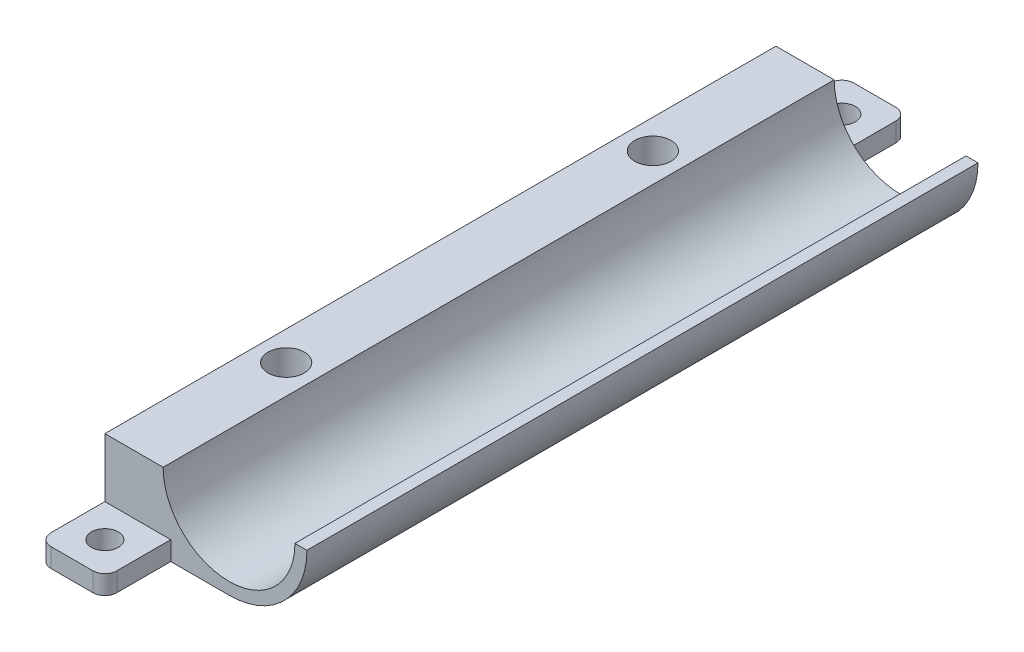
ISO-10303-21;
HEADER;
FILE_DESCRIPTION(('STEP AP214'),'2;1');
FILE_NAME('part.step','',(''),(''),'','','');
FILE_SCHEMA(('AUTOMOTIVE_DESIGN { 1 0 10303 214 1 1 1 1 }'));
ENDSEC;
DATA;
#1=APPLICATION_CONTEXT('core data for automotive mechanical design processes');
#2=APPLICATION_PROTOCOL_DEFINITION('international standard','automotive_design',2000,#1);
#3=PRODUCT_CONTEXT('',#1,'mechanical');
#4=PRODUCT('Part','Part','',(#3));
#5=PRODUCT_RELATED_PRODUCT_CATEGORY('part','',(#4));
#6=PRODUCT_DEFINITION_FORMATION('','',#4);
#7=PRODUCT_DEFINITION_CONTEXT('part definition',#1,'design');
#8=PRODUCT_DEFINITION('design','',#6,#7);
#9=PRODUCT_DEFINITION_SHAPE('','',#8);
#10=(LENGTH_UNIT() NAMED_UNIT(*) SI_UNIT(.MILLI.,.METRE.));
#11=(NAMED_UNIT(*) PLANE_ANGLE_UNIT() SI_UNIT($,.RADIAN.));
#12=(NAMED_UNIT(*) SI_UNIT($,.STERADIAN.) SOLID_ANGLE_UNIT());
#13=UNCERTAINTY_MEASURE_WITH_UNIT(LENGTH_MEASURE(1.E-05),#10,'distance_accuracy_value','');
#14=(GEOMETRIC_REPRESENTATION_CONTEXT(3) GLOBAL_UNCERTAINTY_ASSIGNED_CONTEXT((#13)) GLOBAL_UNIT_ASSIGNED_CONTEXT((#10,
#11,#12)) REPRESENTATION_CONTEXT('',''));
#15=CARTESIAN_POINT('',(0.,0.,0.));
#16=DIRECTION('',(0.,0.,1.));
#17=DIRECTION('',(1.,0.,0.));
#18=AXIS2_PLACEMENT_3D('',#15,#16,#17);
#19=CARTESIAN_POINT('',(0.,0.,0.));
#20=DIRECTION('',(0.,0.,1.));
#21=DIRECTION('',(1.,0.,0.));
#22=AXIS2_PLACEMENT_3D('',#19,#20,#21);
#23=PLANE('',#22);
#24=DIRECTION('',(0.,-1.,0.));
#25=VECTOR('',#24,1.);
#26=CARTESIAN_POINT('',(-9.72445778527406,-9.825,0.));
#27=LINE('',#26,#25);
#28=CARTESIAN_POINT('',(-9.72445778527406,-9.825,0.));
#29=VERTEX_POINT('',#28);
#30=CARTESIAN_POINT('',(-9.72445778527406,-13.,0.));
#31=VERTEX_POINT('',#30);
#32=EDGE_CURVE('E156',#29,#31,#27,.T.);
#33=ORIENTED_EDGE('',*,*,#32,.F.);
#34=DIRECTION('',(1.,0.,0.));
#35=VECTOR('',#34,1.);
#36=CARTESIAN_POINT('',(0.,-9.825,0.));
#37=LINE('',#36,#35);
#38=CARTESIAN_POINT('',(-20.7244577852741,-9.825,0.));
#39=VERTEX_POINT('',#38);
#40=EDGE_CURVE('E159',#39,#29,#37,.T.);
#41=ORIENTED_EDGE('',*,*,#40,.F.);
#42=DIRECTION('',(0.,-1.,0.));
#43=VECTOR('',#42,1.);
#44=CARTESIAN_POINT('',(-20.7244577852741,0.,0.));
#45=LINE('',#44,#43);
#46=CARTESIAN_POINT('',(-20.7244577852741,0.,0.));
#47=VERTEX_POINT('',#46);
#48=EDGE_CURVE('E219',#47,#39,#45,.T.);
#49=ORIENTED_EDGE('',*,*,#48,.F.);
#50=DIRECTION('',(-1.,0.,0.));
#51=VECTOR('',#50,1.);
#52=CARTESIAN_POINT('',(0.,0.,0.));
#53=LINE('',#52,#51);
#54=CARTESIAN_POINT('',(-11.,0.,0.));
#55=VERTEX_POINT('',#54);
#56=EDGE_CURVE('E243',#55,#47,#53,.T.);
#57=ORIENTED_EDGE('',*,*,#56,.F.);
#58=CARTESIAN_POINT('',(0.,0.,0.));
#59=DIRECTION('',(0.,0.,1.));
#60=DIRECTION('',(1.,0.,0.));
#61=AXIS2_PLACEMENT_3D('',#58,#59,#60);
#62=CIRCLE('',#61,11.);
#63=CARTESIAN_POINT('',(11.,0.,0.));
#64=VERTEX_POINT('',#63);
#65=EDGE_CURVE('E240',#55,#64,#62,.T.);
#66=ORIENTED_EDGE('',*,*,#65,.T.);
#67=DIRECTION('',(1.,0.,0.));
#68=VECTOR('',#67,1.);
#69=CARTESIAN_POINT('',(0.,0.,0.));
#70=LINE('',#69,#68);
#71=CARTESIAN_POINT('',(13.,0.,0.));
#72=VERTEX_POINT('',#71);
#73=EDGE_CURVE('E237',#64,#72,#70,.T.);
#74=ORIENTED_EDGE('',*,*,#73,.T.);
#75=CARTESIAN_POINT('',(0.,0.,0.));
#76=DIRECTION('',(0.,0.,1.));
#77=DIRECTION('',(1.,0.,0.));
#78=AXIS2_PLACEMENT_3D('',#75,#76,#77);
#79=CIRCLE('',#78,13.);
#80=CARTESIAN_POINT('',(0.,-13.,0.));
#81=VERTEX_POINT('',#80);
#82=EDGE_CURVE('E234',#81,#72,#79,.T.);
#83=ORIENTED_EDGE('',*,*,#82,.F.);
#84=DIRECTION('',(1.,0.,0.));
#85=VECTOR('',#84,1.);
#86=CARTESIAN_POINT('',(0.,-13.,0.));
#87=LINE('',#86,#85);
#88=EDGE_CURVE('E162',#31,#81,#87,.T.);
#89=ORIENTED_EDGE('',*,*,#88,.F.);
#90=EDGE_LOOP('',(#33,#41,#49,#57,#66,#74,#83,#89));
#91=FACE_BOUND('',#90,.T.);
#92=ADVANCED_FACE('F43',(#91),#23,.F.);
#93=CARTESIAN_POINT('',(0.,-13.,112.));
#94=DIRECTION('',(0.,1.,0.));
#95=DIRECTION('',(0.,0.,1.));
#96=AXIS2_PLACEMENT_3D('',#93,#94,#95);
#97=PLANE('',#96);
#98=CARTESIAN_POINT('',(-15.2244577852741,-13.,-5.49999999999999));
#99=DIRECTION('',(0.,-1.,0.));
#100=DIRECTION('',(0.,0.,-1.));
#101=AXIS2_PLACEMENT_3D('',#98,#99,#100);
#102=CIRCLE('',#101,2.25);
#103=CARTESIAN_POINT('',(-15.2244577852741,-13.,-7.74999999999999));
#104=VERTEX_POINT('',#103);
#105=EDGE_CURVE('E421',#104,#104,#102,.T.);
#106=ORIENTED_EDGE('',*,*,#105,.F.);
#107=EDGE_LOOP('',(#106));
#108=FACE_BOUND('',#107,.T.);
#109=CARTESIAN_POINT('',(-15.2244577852741,-13.,117.5));
#110=DIRECTION('',(0.,-1.,0.));
#111=DIRECTION('',(0.,0.,-1.));
#112=AXIS2_PLACEMENT_3D('',#109,#110,#111);
#113=CIRCLE('',#112,2.25);
#114=CARTESIAN_POINT('',(-15.2244577852741,-13.,115.25));
#115=VERTEX_POINT('',#114);
#116=EDGE_CURVE('E425',#115,#115,#113,.T.);
#117=ORIENTED_EDGE('',*,*,#116,.F.);
#118=EDGE_LOOP('',(#117));
#119=FACE_BOUND('',#118,.T.);
#120=DIRECTION('',(1.,0.,0.));
#121=VECTOR('',#120,1.);
#122=CARTESIAN_POINT('',(0.,-13.,123.));
#123=LINE('',#122,#121);
#124=CARTESIAN_POINT('',(-18.7244577852741,-13.,123.));
#125=VERTEX_POINT('',#124);
#126=CARTESIAN_POINT('',(-11.7244577852741,-13.,123.));
#127=VERTEX_POINT('',#126);
#128=EDGE_CURVE('E188',#125,#127,#123,.T.);
#129=ORIENTED_EDGE('',*,*,#128,.F.);
#130=CARTESIAN_POINT('',(-18.7244577852741,-13.,121.));
#131=DIRECTION('',(0.,1.,0.));
#132=DIRECTION('',(0.,0.,1.));
#133=AXIS2_PLACEMENT_3D('',#130,#131,#132);
#134=CIRCLE('',#133,2.);
#135=CARTESIAN_POINT('',(-20.7244577852741,-13.,121.));
#136=VERTEX_POINT('',#135);
#137=EDGE_CURVE('E271',#125,#136,#134,.F.);
#138=ORIENTED_EDGE('',*,*,#137,.T.);
#139=DIRECTION('',(0.,0.,-1.));
#140=VECTOR('',#139,1.);
#141=CARTESIAN_POINT('',(-20.7244577852741,-13.,112.));
#142=LINE('',#141,#140);
#143=CARTESIAN_POINT('',(-20.7244577852741,-13.,-9.00000000000001));
#144=VERTEX_POINT('',#143);
#145=EDGE_CURVE('E232',#136,#144,#142,.T.);
#146=ORIENTED_EDGE('',*,*,#145,.T.);
#147=CARTESIAN_POINT('',(-18.7244577852741,-13.,-9.00000000000001));
#148=DIRECTION('',(0.,1.,0.));
#149=DIRECTION('',(0.,0.,1.));
#150=AXIS2_PLACEMENT_3D('',#147,#148,#149);
#151=CIRCLE('',#150,2.);
#152=CARTESIAN_POINT('',(-18.7244577852741,-13.,-11.));
#153=VERTEX_POINT('',#152);
#154=EDGE_CURVE('E265',#144,#153,#151,.F.);
#155=ORIENTED_EDGE('',*,*,#154,.T.);
#156=DIRECTION('',(1.,0.,0.));
#157=VECTOR('',#156,1.);
#158=CARTESIAN_POINT('',(0.,-13.,-11.));
#159=LINE('',#158,#157);
#160=CARTESIAN_POINT('',(-11.7244577852741,-13.,-11.));
#161=VERTEX_POINT('',#160);
#162=EDGE_CURVE('E178',#153,#161,#159,.T.);
#163=ORIENTED_EDGE('',*,*,#162,.T.);
#164=CARTESIAN_POINT('',(-11.7244577852741,-13.,-9.00000000000001));
#165=DIRECTION('',(0.,1.,0.));
#166=DIRECTION('',(0.,0.,1.));
#167=AXIS2_PLACEMENT_3D('',#164,#165,#166);
#168=CIRCLE('',#167,2.);
#169=CARTESIAN_POINT('',(-9.72445778527406,-13.,-9.00000000000001));
#170=VERTEX_POINT('',#169);
#171=EDGE_CURVE('E267',#161,#170,#168,.F.);
#172=ORIENTED_EDGE('',*,*,#171,.T.);
#173=DIRECTION('',(0.,0.,-1.));
#174=VECTOR('',#173,1.);
#175=CARTESIAN_POINT('',(-9.72445778527406,-13.,0.));
#176=LINE('',#175,#174);
#177=EDGE_CURVE('E181',#31,#170,#176,.T.);
#178=ORIENTED_EDGE('',*,*,#177,.F.);
#179=ORIENTED_EDGE('',*,*,#88,.T.);
#180=DIRECTION('',(0.,0.,-1.));
#181=VECTOR('',#180,1.);
#182=CARTESIAN_POINT('',(0.,-13.,112.));
#183=LINE('',#182,#181);
#184=CARTESIAN_POINT('',(0.,-13.,112.));
#185=VERTEX_POINT('',#184);
#186=EDGE_CURVE('E257',#185,#81,#183,.T.);
#187=ORIENTED_EDGE('',*,*,#186,.F.);
#188=DIRECTION('',(1.,0.,0.));
#189=VECTOR('',#188,1.);
#190=CARTESIAN_POINT('',(0.,-13.,112.));
#191=LINE('',#190,#189);
#192=CARTESIAN_POINT('',(-9.72445778527406,-13.,112.));
#193=VERTEX_POINT('',#192);
#194=EDGE_CURVE('E216',#193,#185,#191,.T.);
#195=ORIENTED_EDGE('',*,*,#194,.F.);
#196=DIRECTION('',(0.,0.,1.));
#197=VECTOR('',#196,1.);
#198=CARTESIAN_POINT('',(-9.72445778527406,-13.,0.));
#199=LINE('',#198,#197);
#200=CARTESIAN_POINT('',(-9.72445778527406,-13.,121.));
#201=VERTEX_POINT('',#200);
#202=EDGE_CURVE('E164',#193,#201,#199,.T.);
#203=ORIENTED_EDGE('',*,*,#202,.T.);
#204=CARTESIAN_POINT('',(-11.7244577852741,-13.,121.));
#205=DIRECTION('',(0.,1.,0.));
#206=DIRECTION('',(0.,0.,1.));
#207=AXIS2_PLACEMENT_3D('',#204,#205,#206);
#208=CIRCLE('',#207,2.);
#209=EDGE_CURVE('E269',#201,#127,#208,.F.);
#210=ORIENTED_EDGE('',*,*,#209,.T.);
#211=EDGE_LOOP('',(#129,#138,#146,#155,#163,#172,#178,#179,#187,#195,#203,#210));
#212=FACE_BOUND('',#211,.T.);
#213=ADVANCED_FACE('F300',(#108,#119,#212),#97,.F.);
#214=CARTESIAN_POINT('',(0.,0.,112.));
#215=DIRECTION('',(0.,0.,-1.));
#216=DIRECTION('',(-1.,0.,0.));
#217=AXIS2_PLACEMENT_3D('',#214,#215,#216);
#218=CYLINDRICAL_SURFACE('',#217,13.);
#219=ORIENTED_EDGE('',*,*,#82,.T.);
#220=DIRECTION('',(0.,0.,-1.));
#221=VECTOR('',#220,1.);
#222=CARTESIAN_POINT('',(13.,0.,112.));
#223=LINE('',#222,#221);
#224=CARTESIAN_POINT('',(13.,0.,112.));
#225=VERTEX_POINT('',#224);
#226=EDGE_CURVE('E255',#225,#72,#223,.T.);
#227=ORIENTED_EDGE('',*,*,#226,.F.);
#228=CARTESIAN_POINT('',(0.,0.,112.));
#229=DIRECTION('',(0.,0.,1.));
#230=DIRECTION('',(1.,0.,0.));
#231=AXIS2_PLACEMENT_3D('',#228,#229,#230);
#232=CIRCLE('',#231,13.);
#233=EDGE_CURVE('E218',#185,#225,#232,.T.);
#234=ORIENTED_EDGE('',*,*,#233,.F.);
#235=ORIENTED_EDGE('',*,*,#186,.T.);
#236=EDGE_LOOP('',(#219,#227,#234,#235));
#237=FACE_BOUND('',#236,.T.);
#238=ADVANCED_FACE('F312',(#237),#218,.T.);
#239=CARTESIAN_POINT('',(0.,0.,112.));
#240=DIRECTION('',(0.,1.,0.));
#241=DIRECTION('',(0.,0.,1.));
#242=AXIS2_PLACEMENT_3D('',#239,#240,#241);
#243=PLANE('',#242);
#244=ORIENTED_EDGE('',*,*,#73,.F.);
#245=DIRECTION('',(0.,0.,-1.));
#246=VECTOR('',#245,1.);
#247=CARTESIAN_POINT('',(11.,0.,112.));
#248=LINE('',#247,#246);
#249=CARTESIAN_POINT('',(11.,0.,112.));
#250=VERTEX_POINT('',#249);
#251=EDGE_CURVE('E253',#250,#64,#248,.T.);
#252=ORIENTED_EDGE('',*,*,#251,.F.);
#253=DIRECTION('',(1.,0.,0.));
#254=VECTOR('',#253,1.);
#255=CARTESIAN_POINT('',(0.,0.,112.));
#256=LINE('',#255,#254);
#257=EDGE_CURVE('E221',#250,#225,#256,.T.);
#258=ORIENTED_EDGE('',*,*,#257,.T.);
#259=ORIENTED_EDGE('',*,*,#226,.T.);
#260=EDGE_LOOP('',(#244,#252,#258,#259));
#261=FACE_BOUND('',#260,.T.);
#262=ADVANCED_FACE('F346',(#261),#243,.T.);
#263=CARTESIAN_POINT('',(0.,0.,112.));
#264=DIRECTION('',(0.,0.,-1.));
#265=DIRECTION('',(-1.,0.,0.));
#266=AXIS2_PLACEMENT_3D('',#263,#264,#265);
#267=CYLINDRICAL_SURFACE('',#266,11.);
#268=ORIENTED_EDGE('',*,*,#65,.F.);
#269=DIRECTION('',(0.,0.,-1.));
#270=VECTOR('',#269,1.);
#271=CARTESIAN_POINT('',(-11.,0.,112.));
#272=LINE('',#271,#270);
#273=CARTESIAN_POINT('',(-11.,0.,112.));
#274=VERTEX_POINT('',#273);
#275=EDGE_CURVE('E251',#274,#55,#272,.T.);
#276=ORIENTED_EDGE('',*,*,#275,.F.);
#277=CARTESIAN_POINT('',(0.,0.,112.));
#278=DIRECTION('',(0.,0.,1.));
#279=DIRECTION('',(1.,0.,0.));
#280=AXIS2_PLACEMENT_3D('',#277,#278,#279);
#281=CIRCLE('',#280,11.);
#282=EDGE_CURVE('E224',#274,#250,#281,.T.);
#283=ORIENTED_EDGE('',*,*,#282,.T.);
#284=ORIENTED_EDGE('',*,*,#251,.T.);
#285=EDGE_LOOP('',(#268,#276,#283,#284));
#286=FACE_BOUND('',#285,.T.);
#287=ADVANCED_FACE('F344',(#286),#267,.F.);
#288=CARTESIAN_POINT('',(0.,0.,112.));
#289=DIRECTION('',(0.,-1.,0.));
#290=DIRECTION('',(1.,0.,0.));
#291=AXIS2_PLACEMENT_3D('',#288,#289,#290);
#292=PLANE('',#291);
#293=CARTESIAN_POINT('',(-15.862228892637,0.,25.4));
#294=DIRECTION('',(0.,1.,0.));
#295=DIRECTION('',(-1.,0.,0.));
#296=AXIS2_PLACEMENT_3D('',#293,#294,#295);
#297=CIRCLE('',#296,3.025);
#298=CARTESIAN_POINT('',(-18.887228892637,0.,25.4));
#299=VERTEX_POINT('',#298);
#300=EDGE_CURVE('E208',#299,#299,#297,.T.);
#301=ORIENTED_EDGE('',*,*,#300,.F.);
#302=EDGE_LOOP('',(#301));
#303=FACE_BOUND('',#302,.T.);
#304=CARTESIAN_POINT('',(-15.862228892637,0.,86.6));
#305=DIRECTION('',(0.,1.,0.));
#306=DIRECTION('',(-1.,0.,0.));
#307=AXIS2_PLACEMENT_3D('',#304,#305,#306);
#308=CIRCLE('',#307,3.025);
#309=CARTESIAN_POINT('',(-18.887228892637,0.,86.6));
#310=VERTEX_POINT('',#309);
#311=EDGE_CURVE('E211',#310,#310,#308,.T.);
#312=ORIENTED_EDGE('',*,*,#311,.F.);
#313=EDGE_LOOP('',(#312));
#314=FACE_BOUND('',#313,.T.);
#315=ORIENTED_EDGE('',*,*,#56,.T.);
#316=DIRECTION('',(0.,0.,-1.));
#317=VECTOR('',#316,1.);
#318=CARTESIAN_POINT('',(-20.7244577852741,0.,112.));
#319=LINE('',#318,#317);
#320=CARTESIAN_POINT('',(-20.7244577852741,0.,112.));
#321=VERTEX_POINT('',#320);
#322=EDGE_CURVE('E248',#321,#47,#319,.T.);
#323=ORIENTED_EDGE('',*,*,#322,.F.);
#324=DIRECTION('',(-1.,0.,0.));
#325=VECTOR('',#324,1.);
#326=CARTESIAN_POINT('',(0.,0.,112.));
#327=LINE('',#326,#325);
#328=EDGE_CURVE('E227',#274,#321,#327,.T.);
#329=ORIENTED_EDGE('',*,*,#328,.F.);
#330=ORIENTED_EDGE('',*,*,#275,.T.);
#331=EDGE_LOOP('',(#315,#323,#329,#330));
#332=FACE_BOUND('',#331,.T.);
#333=ADVANCED_FACE('F340',(#303,#314,#332),#292,.F.);
#334=CARTESIAN_POINT('',(-20.7244577852741,0.,112.));
#335=DIRECTION('',(1.,0.,0.));
#336=DIRECTION('',(0.,0.,-1.));
#337=AXIS2_PLACEMENT_3D('',#334,#335,#336);
#338=PLANE('',#337);
#339=ORIENTED_EDGE('',*,*,#145,.F.);
#340=DIRECTION('',(0.,-1.,0.));
#341=VECTOR('',#340,1.);
#342=CARTESIAN_POINT('',(-20.7244577852741,0.,121.));
#343=LINE('',#342,#341);
#344=CARTESIAN_POINT('',(-20.7244577852741,-9.825,121.));
#345=VERTEX_POINT('',#344);
#346=EDGE_CURVE('E276',#136,#345,#343,.F.);
#347=ORIENTED_EDGE('',*,*,#346,.T.);
#348=DIRECTION('',(0.,0.,1.));
#349=VECTOR('',#348,1.);
#350=CARTESIAN_POINT('',(-20.7244577852741,-9.825,0.));
#351=LINE('',#350,#349);
#352=CARTESIAN_POINT('',(-20.7244577852741,-9.825,112.));
#353=VERTEX_POINT('',#352);
#354=EDGE_CURVE('E194',#353,#345,#351,.T.);
#355=ORIENTED_EDGE('',*,*,#354,.F.);
#356=DIRECTION('',(0.,-1.,0.));
#357=VECTOR('',#356,1.);
#358=CARTESIAN_POINT('',(-20.7244577852741,0.,112.));
#359=LINE('',#358,#357);
#360=EDGE_CURVE('E229',#321,#353,#359,.T.);
#361=ORIENTED_EDGE('',*,*,#360,.F.);
#362=ORIENTED_EDGE('',*,*,#322,.T.);
#363=ORIENTED_EDGE('',*,*,#48,.T.);
#364=DIRECTION('',(0.,0.,-1.));
#365=VECTOR('',#364,1.);
#366=CARTESIAN_POINT('',(-20.7244577852741,-9.825,0.));
#367=LINE('',#366,#365);
#368=CARTESIAN_POINT('',(-20.7244577852741,-9.825,-9.00000000000001));
#369=VERTEX_POINT('',#368);
#370=EDGE_CURVE('E170',#39,#369,#367,.T.);
#371=ORIENTED_EDGE('',*,*,#370,.T.);
#372=DIRECTION('',(0.,-1.,0.));
#373=VECTOR('',#372,1.);
#374=CARTESIAN_POINT('',(-20.7244577852741,-13.,-9.00000000000001));
#375=LINE('',#374,#373);
#376=EDGE_CURVE('E273',#369,#144,#375,.T.);
#377=ORIENTED_EDGE('',*,*,#376,.T.);
#378=EDGE_LOOP('',(#339,#347,#355,#361,#362,#363,#371,#377));
#379=FACE_BOUND('',#378,.T.);
#380=ADVANCED_FACE('F296',(#379),#338,.F.);
#381=CARTESIAN_POINT('',(0.,0.,112.));
#382=DIRECTION('',(0.,0.,1.));
#383=DIRECTION('',(1.,0.,0.));
#384=AXIS2_PLACEMENT_3D('',#381,#382,#383);
#385=PLANE('',#384);
#386=DIRECTION('',(-1.,0.,0.));
#387=VECTOR('',#386,1.);
#388=CARTESIAN_POINT('',(0.,-9.825,112.));
#389=LINE('',#388,#387);
#390=CARTESIAN_POINT('',(-9.72445778527406,-9.825,112.));
#391=VERTEX_POINT('',#390);
#392=EDGE_CURVE('E184',#391,#353,#389,.T.);
#393=ORIENTED_EDGE('',*,*,#392,.F.);
#394=DIRECTION('',(0.,-1.,0.));
#395=VECTOR('',#394,1.);
#396=CARTESIAN_POINT('',(-9.72445778527406,-9.825,112.));
#397=LINE('',#396,#395);
#398=EDGE_CURVE('E197',#391,#193,#397,.T.);
#399=ORIENTED_EDGE('',*,*,#398,.T.);
#400=ORIENTED_EDGE('',*,*,#194,.T.);
#401=ORIENTED_EDGE('',*,*,#233,.T.);
#402=ORIENTED_EDGE('',*,*,#257,.F.);
#403=ORIENTED_EDGE('',*,*,#282,.F.);
#404=ORIENTED_EDGE('',*,*,#328,.T.);
#405=ORIENTED_EDGE('',*,*,#360,.T.);
#406=EDGE_LOOP('',(#393,#399,#400,#401,#402,#403,#404,#405));
#407=FACE_BOUND('',#406,.T.);
#408=ADVANCED_FACE('F316',(#407),#385,.T.);
#409=CARTESIAN_POINT('',(-15.862228892637,-8.,86.6));
#410=DIRECTION('',(0.,1.,0.));
#411=DIRECTION('',(-1.,0.,0.));
#412=AXIS2_PLACEMENT_3D('',#409,#410,#411);
#413=CYLINDRICAL_SURFACE('',#412,3.025);
#414=CARTESIAN_POINT('',(-15.862228892637,-8.,86.6));
#415=DIRECTION('',(0.,1.,0.));
#416=DIRECTION('',(-1.,0.,0.));
#417=AXIS2_PLACEMENT_3D('',#414,#415,#416);
#418=CIRCLE('',#417,3.025);
#419=CARTESIAN_POINT('',(-18.887228892637,-8.,86.6));
#420=VERTEX_POINT('',#419);
#421=EDGE_CURVE('E204',#420,#420,#418,.T.);
#422=ORIENTED_EDGE('',*,*,#421,.F.);
#423=EDGE_LOOP('',(#422));
#424=FACE_BOUND('',#423,.T.);
#425=ORIENTED_EDGE('',*,*,#311,.T.);
#426=EDGE_LOOP('',(#425));
#427=FACE_BOUND('',#426,.T.);
#428=ADVANCED_FACE('F378',(#424,#427),#413,.F.);
#429=CARTESIAN_POINT('',(-15.862228892637,-8.,86.6));
#430=DIRECTION('',(0.,1.,0.));
#431=DIRECTION('',(-1.,0.,0.));
#432=AXIS2_PLACEMENT_3D('',#429,#430,#431);
#433=PLANE('',#432);
#434=ORIENTED_EDGE('',*,*,#421,.T.);
#435=EDGE_LOOP('',(#434));
#436=FACE_BOUND('',#435,.T.);
#437=ADVANCED_FACE('F379',(#436),#433,.T.);
#438=CARTESIAN_POINT('',(-15.862228892637,-8.,25.4));
#439=DIRECTION('',(0.,1.,0.));
#440=DIRECTION('',(-1.,0.,0.));
#441=AXIS2_PLACEMENT_3D('',#438,#439,#440);
#442=CYLINDRICAL_SURFACE('',#441,3.025);
#443=CARTESIAN_POINT('',(-15.862228892637,-8.,25.4));
#444=DIRECTION('',(0.,1.,0.));
#445=DIRECTION('',(-1.,0.,0.));
#446=AXIS2_PLACEMENT_3D('',#443,#444,#445);
#447=CIRCLE('',#446,3.025);
#448=CARTESIAN_POINT('',(-18.887228892637,-8.,25.4));
#449=VERTEX_POINT('',#448);
#450=EDGE_CURVE('E205',#449,#449,#447,.T.);
#451=ORIENTED_EDGE('',*,*,#450,.F.);
#452=EDGE_LOOP('',(#451));
#453=FACE_BOUND('',#452,.T.);
#454=ORIENTED_EDGE('',*,*,#300,.T.);
#455=EDGE_LOOP('',(#454));
#456=FACE_BOUND('',#455,.T.);
#457=ADVANCED_FACE('F385',(#453,#456),#442,.F.);
#458=CARTESIAN_POINT('',(-15.862228892637,-8.,25.4));
#459=DIRECTION('',(0.,1.,0.));
#460=DIRECTION('',(-1.,0.,0.));
#461=AXIS2_PLACEMENT_3D('',#458,#459,#460);
#462=PLANE('',#461);
#463=ORIENTED_EDGE('',*,*,#450,.T.);
#464=EDGE_LOOP('',(#463));
#465=FACE_BOUND('',#464,.T.);
#466=ADVANCED_FACE('F391',(#465),#462,.T.);
#467=CARTESIAN_POINT('',(0.,-9.825,123.));
#468=DIRECTION('',(0.,0.,-1.));
#469=DIRECTION('',(-1.,0.,0.));
#470=AXIS2_PLACEMENT_3D('',#467,#468,#469);
#471=PLANE('',#470);
#472=DIRECTION('',(1.,0.,0.));
#473=VECTOR('',#472,1.);
#474=CARTESIAN_POINT('',(0.,-9.825,123.));
#475=LINE('',#474,#473);
#476=CARTESIAN_POINT('',(-18.7244577852741,-9.825,123.));
#477=VERTEX_POINT('',#476);
#478=CARTESIAN_POINT('',(-11.7244577852741,-9.825,123.));
#479=VERTEX_POINT('',#478);
#480=EDGE_CURVE('E191',#477,#479,#475,.T.);
#481=ORIENTED_EDGE('',*,*,#480,.F.);
#482=DIRECTION('',(0.,-1.,0.));
#483=VECTOR('',#482,1.);
#484=CARTESIAN_POINT('',(-18.7244577852741,-9.825,123.));
#485=LINE('',#484,#483);
#486=EDGE_CURVE('E262',#477,#125,#485,.T.);
#487=ORIENTED_EDGE('',*,*,#486,.T.);
#488=ORIENTED_EDGE('',*,*,#128,.T.);
#489=DIRECTION('',(0.,-1.,0.));
#490=VECTOR('',#489,1.);
#491=CARTESIAN_POINT('',(-11.7244577852741,-9.825,123.));
#492=LINE('',#491,#490);
#493=EDGE_CURVE('E260',#127,#479,#492,.F.);
#494=ORIENTED_EDGE('',*,*,#493,.T.);
#495=EDGE_LOOP('',(#481,#487,#488,#494));
#496=FACE_BOUND('',#495,.T.);
#497=ADVANCED_FACE('F328',(#496),#471,.F.);
#498=CARTESIAN_POINT('',(-9.72445778527406,-9.825,0.));
#499=DIRECTION('',(1.,0.,0.));
#500=DIRECTION('',(0.,0.,-1.));
#501=AXIS2_PLACEMENT_3D('',#498,#499,#500);
#502=PLANE('',#501);
#503=DIRECTION('',(0.,0.,1.));
#504=VECTOR('',#503,1.);
#505=CARTESIAN_POINT('',(-9.72445778527406,-9.825,0.));
#506=LINE('',#505,#504);
#507=CARTESIAN_POINT('',(-9.72445778527406,-9.825,121.));
#508=VERTEX_POINT('',#507);
#509=EDGE_CURVE('E187',#391,#508,#506,.T.);
#510=ORIENTED_EDGE('',*,*,#509,.T.);
#511=DIRECTION('',(0.,-1.,0.));
#512=VECTOR('',#511,1.);
#513=CARTESIAN_POINT('',(-9.72445778527406,-13.,121.));
#514=LINE('',#513,#512);
#515=EDGE_CURVE('E282',#508,#201,#514,.T.);
#516=ORIENTED_EDGE('',*,*,#515,.T.);
#517=ORIENTED_EDGE('',*,*,#202,.F.);
#518=ORIENTED_EDGE('',*,*,#398,.F.);
#519=EDGE_LOOP('',(#510,#516,#517,#518));
#520=FACE_BOUND('',#519,.T.);
#521=ADVANCED_FACE('F319',(#520),#502,.T.);
#522=CARTESIAN_POINT('',(0.,-9.825,0.));
#523=DIRECTION('',(0.,-1.,0.));
#524=DIRECTION('',(0.,0.,-1.));
#525=AXIS2_PLACEMENT_3D('',#522,#523,#524);
#526=PLANE('',#525);
#527=CARTESIAN_POINT('',(-15.2244577852741,-9.825,117.5));
#528=DIRECTION('',(0.,-1.,0.));
#529=DIRECTION('',(0.,0.,-1.));
#530=AXIS2_PLACEMENT_3D('',#527,#528,#529);
#531=CIRCLE('',#530,2.25);
#532=CARTESIAN_POINT('',(-15.2244577852741,-9.825,115.25));
#533=VERTEX_POINT('',#532);
#534=EDGE_CURVE('E182',#533,#533,#531,.T.);
#535=ORIENTED_EDGE('',*,*,#534,.T.);
#536=EDGE_LOOP('',(#535));
#537=FACE_BOUND('',#536,.T.);
#538=ORIENTED_EDGE('',*,*,#354,.T.);
#539=CARTESIAN_POINT('',(-18.7244577852741,-9.825,121.));
#540=DIRECTION('',(0.,-1.,0.));
#541=DIRECTION('',(0.,0.,-1.));
#542=AXIS2_PLACEMENT_3D('',#539,#540,#541);
#543=CIRCLE('',#542,2.);
#544=EDGE_CURVE('E280',#345,#477,#543,.F.);
#545=ORIENTED_EDGE('',*,*,#544,.T.);
#546=ORIENTED_EDGE('',*,*,#480,.T.);
#547=CARTESIAN_POINT('',(-11.7244577852741,-9.825,121.));
#548=DIRECTION('',(0.,-1.,0.));
#549=DIRECTION('',(0.,0.,-1.));
#550=AXIS2_PLACEMENT_3D('',#547,#548,#549);
#551=CIRCLE('',#550,2.);
#552=EDGE_CURVE('E278',#479,#508,#551,.F.);
#553=ORIENTED_EDGE('',*,*,#552,.T.);
#554=ORIENTED_EDGE('',*,*,#509,.F.);
#555=ORIENTED_EDGE('',*,*,#392,.T.);
#556=EDGE_LOOP('',(#538,#545,#546,#553,#554,#555));
#557=FACE_BOUND('',#556,.T.);
#558=ADVANCED_FACE('F331',(#537,#557),#526,.F.);
#559=CARTESIAN_POINT('',(-9.72445778527406,-9.825,0.));
#560=DIRECTION('',(-1.,0.,0.));
#561=DIRECTION('',(0.,0.,1.));
#562=AXIS2_PLACEMENT_3D('',#559,#560,#561);
#563=PLANE('',#562);
#564=ORIENTED_EDGE('',*,*,#177,.T.);
#565=DIRECTION('',(0.,-1.,0.));
#566=VECTOR('',#565,1.);
#567=CARTESIAN_POINT('',(-9.72445778527406,-9.825,-9.00000000000001));
#568=LINE('',#567,#566);
#569=CARTESIAN_POINT('',(-9.72445778527406,-9.825,-9.00000000000001));
#570=VERTEX_POINT('',#569);
#571=EDGE_CURVE('E58',#170,#570,#568,.F.);
#572=ORIENTED_EDGE('',*,*,#571,.T.);
#573=DIRECTION('',(0.,0.,-1.));
#574=VECTOR('',#573,1.);
#575=CARTESIAN_POINT('',(-9.72445778527406,-9.825,0.));
#576=LINE('',#575,#574);
#577=EDGE_CURVE('E168',#29,#570,#576,.T.);
#578=ORIENTED_EDGE('',*,*,#577,.F.);
#579=ORIENTED_EDGE('',*,*,#32,.T.);
#580=EDGE_LOOP('',(#564,#572,#578,#579));
#581=FACE_BOUND('',#580,.T.);
#582=ADVANCED_FACE('F172',(#581),#563,.F.);
#583=CARTESIAN_POINT('',(0.,-9.825,-11.));
#584=DIRECTION('',(0.,0.,-1.));
#585=DIRECTION('',(-1.,0.,0.));
#586=AXIS2_PLACEMENT_3D('',#583,#584,#585);
#587=PLANE('',#586);
#588=DIRECTION('',(1.,0.,0.));
#589=VECTOR('',#588,1.);
#590=CARTESIAN_POINT('',(0.,-9.825,-11.));
#591=LINE('',#590,#589);
#592=CARTESIAN_POINT('',(-18.7244577852741,-9.825,-11.));
#593=VERTEX_POINT('',#592);
#594=CARTESIAN_POINT('',(-11.7244577852741,-9.825,-11.));
#595=VERTEX_POINT('',#594);
#596=EDGE_CURVE('E173',#593,#595,#591,.T.);
#597=ORIENTED_EDGE('',*,*,#596,.T.);
#598=DIRECTION('',(0.,-1.,0.));
#599=VECTOR('',#598,1.);
#600=CARTESIAN_POINT('',(-11.7244577852741,-13.,-11.));
#601=LINE('',#600,#599);
#602=EDGE_CURVE('E287',#595,#161,#601,.T.);
#603=ORIENTED_EDGE('',*,*,#602,.T.);
#604=ORIENTED_EDGE('',*,*,#162,.F.);
#605=DIRECTION('',(0.,-1.,0.));
#606=VECTOR('',#605,1.);
#607=CARTESIAN_POINT('',(-18.7244577852741,-9.825,-11.));
#608=LINE('',#607,#606);
#609=EDGE_CURVE('E285',#153,#593,#608,.F.);
#610=ORIENTED_EDGE('',*,*,#609,.T.);
#611=EDGE_LOOP('',(#597,#603,#604,#610));
#612=FACE_BOUND('',#611,.T.);
#613=ADVANCED_FACE('F302',(#612),#587,.T.);
#614=CARTESIAN_POINT('',(0.,-9.825,0.));
#615=DIRECTION('',(0.,-1.,0.));
#616=DIRECTION('',(0.,0.,-1.));
#617=AXIS2_PLACEMENT_3D('',#614,#615,#616);
#618=PLANE('',#617);
#619=CARTESIAN_POINT('',(-15.2244577852741,-9.825,-5.49999999999999));
#620=DIRECTION('',(0.,-1.,0.));
#621=DIRECTION('',(0.,0.,-1.));
#622=AXIS2_PLACEMENT_3D('',#619,#620,#621);
#623=CIRCLE('',#622,2.25);
#624=CARTESIAN_POINT('',(-15.2244577852741,-9.825,-7.74999999999999));
#625=VERTEX_POINT('',#624);
#626=EDGE_CURVE('E424',#625,#625,#623,.T.);
#627=ORIENTED_EDGE('',*,*,#626,.T.);
#628=EDGE_LOOP('',(#627));
#629=FACE_BOUND('',#628,.T.);
#630=ORIENTED_EDGE('',*,*,#577,.T.);
#631=CARTESIAN_POINT('',(-11.7244577852741,-9.825,-9.00000000000001));
#632=DIRECTION('',(0.,-1.,0.));
#633=DIRECTION('',(0.,0.,-1.));
#634=AXIS2_PLACEMENT_3D('',#631,#632,#633);
#635=CIRCLE('',#634,2.);
#636=EDGE_CURVE('E11',#570,#595,#635,.F.);
#637=ORIENTED_EDGE('',*,*,#636,.T.);
#638=ORIENTED_EDGE('',*,*,#596,.F.);
#639=CARTESIAN_POINT('',(-18.7244577852741,-9.825,-9.00000000000001));
#640=DIRECTION('',(0.,-1.,0.));
#641=DIRECTION('',(0.,0.,-1.));
#642=AXIS2_PLACEMENT_3D('',#639,#640,#641);
#643=CIRCLE('',#642,2.);
#644=EDGE_CURVE('E51',#593,#369,#643,.F.);
#645=ORIENTED_EDGE('',*,*,#644,.T.);
#646=ORIENTED_EDGE('',*,*,#370,.F.);
#647=ORIENTED_EDGE('',*,*,#40,.T.);
#648=EDGE_LOOP('',(#630,#637,#638,#645,#646,#647));
#649=FACE_BOUND('',#648,.T.);
#650=ADVANCED_FACE('F167',(#629,#649),#618,.F.);
#651=CARTESIAN_POINT('',(-18.7244577852741,-9.825,121.));
#652=DIRECTION('',(0.,-1.,0.));
#653=DIRECTION('',(0.,0.,-1.));
#654=AXIS2_PLACEMENT_3D('',#651,#652,#653);
#655=CYLINDRICAL_SURFACE('',#654,2.);
#656=ORIENTED_EDGE('',*,*,#544,.F.);
#657=ORIENTED_EDGE('',*,*,#346,.F.);
#658=ORIENTED_EDGE('',*,*,#137,.F.);
#659=ORIENTED_EDGE('',*,*,#486,.F.);
#660=EDGE_LOOP('',(#656,#657,#658,#659));
#661=FACE_BOUND('',#660,.T.);
#662=ADVANCED_FACE('F335',(#661),#655,.T.);
#663=CARTESIAN_POINT('',(-11.7244577852741,-9.825,121.));
#664=DIRECTION('',(0.,1.,0.));
#665=DIRECTION('',(0.,0.,1.));
#666=AXIS2_PLACEMENT_3D('',#663,#664,#665);
#667=CYLINDRICAL_SURFACE('',#666,2.);
#668=ORIENTED_EDGE('',*,*,#552,.F.);
#669=ORIENTED_EDGE('',*,*,#493,.F.);
#670=ORIENTED_EDGE('',*,*,#209,.F.);
#671=ORIENTED_EDGE('',*,*,#515,.F.);
#672=EDGE_LOOP('',(#668,#669,#670,#671));
#673=FACE_BOUND('',#672,.T.);
#674=ADVANCED_FACE('F324',(#673),#667,.T.);
#675=CARTESIAN_POINT('',(-11.7244577852741,-9.825,-9.00000000000001));
#676=DIRECTION('',(0.,1.,0.));
#677=DIRECTION('',(0.,0.,1.));
#678=AXIS2_PLACEMENT_3D('',#675,#676,#677);
#679=CYLINDRICAL_SURFACE('',#678,2.);
#680=ORIENTED_EDGE('',*,*,#636,.F.);
#681=ORIENTED_EDGE('',*,*,#571,.F.);
#682=ORIENTED_EDGE('',*,*,#171,.F.);
#683=ORIENTED_EDGE('',*,*,#602,.F.);
#684=EDGE_LOOP('',(#680,#681,#682,#683));
#685=FACE_BOUND('',#684,.T.);
#686=ADVANCED_FACE('F305',(#685),#679,.T.);
#687=CARTESIAN_POINT('',(-18.7244577852741,0.,-9.00000000000001));
#688=DIRECTION('',(0.,1.,0.));
#689=DIRECTION('',(0.,0.,1.));
#690=AXIS2_PLACEMENT_3D('',#687,#688,#689);
#691=CYLINDRICAL_SURFACE('',#690,2.);
#692=ORIENTED_EDGE('',*,*,#644,.F.);
#693=ORIENTED_EDGE('',*,*,#609,.F.);
#694=ORIENTED_EDGE('',*,*,#154,.F.);
#695=ORIENTED_EDGE('',*,*,#376,.F.);
#696=EDGE_LOOP('',(#692,#693,#694,#695));
#697=FACE_BOUND('',#696,.T.);
#698=ADVANCED_FACE('F45',(#697),#691,.T.);
#699=CARTESIAN_POINT('',(-15.2244577852741,-13.,117.5));
#700=DIRECTION('',(0.,-1.,0.));
#701=DIRECTION('',(0.,0.,-1.));
#702=AXIS2_PLACEMENT_3D('',#699,#700,#701);
#703=CYLINDRICAL_SURFACE('',#702,2.25);
#704=ORIENTED_EDGE('',*,*,#116,.T.);
#705=EDGE_LOOP('',(#704));
#706=FACE_BOUND('',#705,.T.);
#707=ORIENTED_EDGE('',*,*,#534,.F.);
#708=EDGE_LOOP('',(#707));
#709=FACE_BOUND('',#708,.T.);
#710=ADVANCED_FACE('F409',(#706,#709),#703,.F.);
#711=CARTESIAN_POINT('',(-15.2244577852741,-13.,-5.49999999999999));
#712=DIRECTION('',(0.,-1.,0.));
#713=DIRECTION('',(0.,0.,-1.));
#714=AXIS2_PLACEMENT_3D('',#711,#712,#713);
#715=CYLINDRICAL_SURFACE('',#714,2.25);
#716=ORIENTED_EDGE('',*,*,#105,.T.);
#717=EDGE_LOOP('',(#716));
#718=FACE_BOUND('',#717,.T.);
#719=ORIENTED_EDGE('',*,*,#626,.F.);
#720=EDGE_LOOP('',(#719));
#721=FACE_BOUND('',#720,.T.);
#722=ADVANCED_FACE('F412',(#718,#721),#715,.F.);
#723=CLOSED_SHELL('',(#92,#213,#238,#262,#287,#333,#380,#408,#428,#437,#457,#466,#497,#521,#558,
#582,#613,#650,#662,#674,#686,#698,#710,#722));
#724=MANIFOLD_SOLID_BREP('B2',#723);
#725=ADVANCED_BREP_SHAPE_REPRESENTATION('',(#18,#724),#14);
#726=SHAPE_DEFINITION_REPRESENTATION(#9,#725);
ENDSEC;
END-ISO-10303-21;
